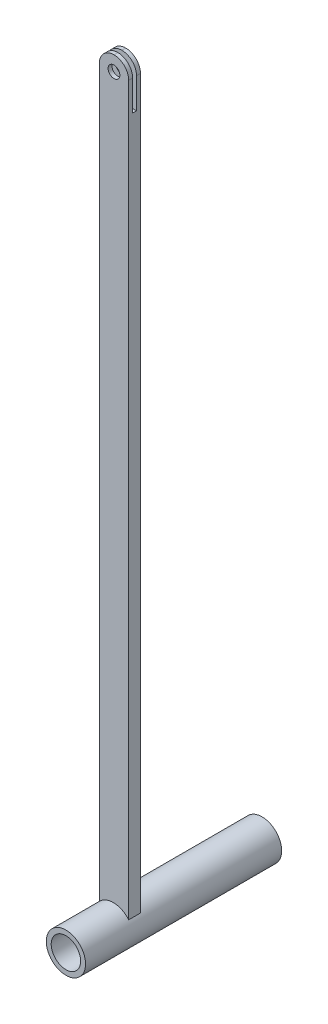
ISO-10303-21;
HEADER;
FILE_DESCRIPTION(('STEP AP214'),'2;1');
FILE_NAME('part.step','',(''),(''),'','','');
FILE_SCHEMA(('AUTOMOTIVE_DESIGN { 1 0 10303 214 1 1 1 1 }'));
ENDSEC;
DATA;
#1=APPLICATION_CONTEXT('core data for automotive mechanical design processes');
#2=APPLICATION_PROTOCOL_DEFINITION('international standard','automotive_design',2000,#1);
#3=PRODUCT_CONTEXT('',#1,'mechanical');
#4=PRODUCT('Part','Part','',(#3));
#5=PRODUCT_RELATED_PRODUCT_CATEGORY('part','',(#4));
#6=PRODUCT_DEFINITION_FORMATION('','',#4);
#7=PRODUCT_DEFINITION_CONTEXT('part definition',#1,'design');
#8=PRODUCT_DEFINITION('design','',#6,#7);
#9=PRODUCT_DEFINITION_SHAPE('','',#8);
#10=(LENGTH_UNIT() NAMED_UNIT(*) SI_UNIT(.MILLI.,.METRE.));
#11=(NAMED_UNIT(*) PLANE_ANGLE_UNIT() SI_UNIT($,.RADIAN.));
#12=(NAMED_UNIT(*) SI_UNIT($,.STERADIAN.) SOLID_ANGLE_UNIT());
#13=UNCERTAINTY_MEASURE_WITH_UNIT(LENGTH_MEASURE(1.E-05),#10,'distance_accuracy_value','');
#14=(GEOMETRIC_REPRESENTATION_CONTEXT(3) GLOBAL_UNCERTAINTY_ASSIGNED_CONTEXT((#13)) GLOBAL_UNIT_ASSIGNED_CONTEXT((#10,
#11,#12)) REPRESENTATION_CONTEXT('',''));
#15=CARTESIAN_POINT('',(0.,0.,0.));
#16=DIRECTION('',(0.,0.,1.));
#17=DIRECTION('',(1.,0.,0.));
#18=AXIS2_PLACEMENT_3D('',#15,#16,#17);
#19=CARTESIAN_POINT('',(0.280971345176614,377.01,0.));
#20=DIRECTION('',(0.,0.,1.));
#21=DIRECTION('',(1.,0.,0.));
#22=AXIS2_PLACEMENT_3D('',#19,#20,#21);
#23=CYLINDRICAL_SURFACE('',#22,7.5);
#24=CARTESIAN_POINT('',(0.280971345176614,377.01,23.7797928905931));
#25=DIRECTION('',(0.,0.,1.));
#26=DIRECTION('',(1.,0.,0.));
#27=AXIS2_PLACEMENT_3D('',#24,#25,#26);
#28=CIRCLE('',#27,7.5);
#29=CARTESIAN_POINT('',(-7.21902865482339,377.01,23.7797928905931));
#30=VERTEX_POINT('',#29);
#31=CARTESIAN_POINT('',(0.280971345176614,384.51,23.7797928905931));
#32=VERTEX_POINT('',#31);
#33=EDGE_CURVE('E148',#30,#32,#28,.F.);
#34=ORIENTED_EDGE('',*,*,#33,.F.);
#35=DIRECTION('',(0.,0.,1.));
#36=VECTOR('',#35,1.);
#37=CARTESIAN_POINT('',(-7.21902865482339,377.01,19.7797928905931));
#38=LINE('',#37,#36);
#39=CARTESIAN_POINT('',(-7.21902865482339,377.01,25.7797928905931));
#40=VERTEX_POINT('',#39);
#41=EDGE_CURVE('E44',#40,#30,#38,.F.);
#42=ORIENTED_EDGE('',*,*,#41,.F.);
#43=CARTESIAN_POINT('',(0.280971345176614,377.01,25.7797928905931));
#44=DIRECTION('',(0.,0.,1.));
#45=DIRECTION('',(1.,0.,0.));
#46=AXIS2_PLACEMENT_3D('',#43,#44,#45);
#47=CIRCLE('',#46,7.5);
#48=CARTESIAN_POINT('',(0.280971345176614,384.51,25.7797928905931));
#49=VERTEX_POINT('',#48);
#50=EDGE_CURVE('E199',#49,#40,#47,.T.);
#51=ORIENTED_EDGE('',*,*,#50,.F.);
#52=DIRECTION('',(0.,0.,1.));
#53=VECTOR('',#52,1.);
#54=CARTESIAN_POINT('',(0.280971345176614,384.51,0.));
#55=LINE('',#54,#53);
#56=EDGE_CURVE('E59',#32,#49,#55,.T.);
#57=ORIENTED_EDGE('',*,*,#56,.F.);
#58=EDGE_LOOP('',(#34,#42,#51,#57));
#59=FACE_BOUND('',#58,.T.);
#60=ADVANCED_FACE('F36',(#59),#23,.T.);
#61=CARTESIAN_POINT('',(0.280971345176615,377.01,0.));
#62=DIRECTION('',(0.,0.,-1.));
#63=DIRECTION('',(-1.,0.,0.));
#64=AXIS2_PLACEMENT_3D('',#61,#62,#63);
#65=CYLINDRICAL_SURFACE('',#64,7.5);
#66=CARTESIAN_POINT('',(0.280971345176615,377.01,23.7797928905931));
#67=DIRECTION('',(0.,0.,1.));
#68=DIRECTION('',(1.,0.,0.));
#69=AXIS2_PLACEMENT_3D('',#66,#67,#68);
#70=CIRCLE('',#69,7.5);
#71=CARTESIAN_POINT('',(7.78097134517662,377.01,23.7797928905931));
#72=VERTEX_POINT('',#71);
#73=EDGE_CURVE('E146',#32,#72,#70,.F.);
#74=ORIENTED_EDGE('',*,*,#73,.F.);
#75=ORIENTED_EDGE('',*,*,#56,.T.);
#76=CARTESIAN_POINT('',(0.280971345176615,377.01,25.7797928905931));
#77=DIRECTION('',(0.,0.,1.));
#78=DIRECTION('',(1.,0.,0.));
#79=AXIS2_PLACEMENT_3D('',#76,#77,#78);
#80=CIRCLE('',#79,7.5);
#81=CARTESIAN_POINT('',(7.78097134517662,377.01,25.7797928905931));
#82=VERTEX_POINT('',#81);
#83=EDGE_CURVE('E201',#82,#49,#80,.T.);
#84=ORIENTED_EDGE('',*,*,#83,.F.);
#85=DIRECTION('',(0.,0.,-1.));
#86=VECTOR('',#85,1.);
#87=CARTESIAN_POINT('',(7.78097134517662,377.01,19.7797928905931));
#88=LINE('',#87,#86);
#89=EDGE_CURVE('E195',#72,#82,#88,.F.);
#90=ORIENTED_EDGE('',*,*,#89,.F.);
#91=EDGE_LOOP('',(#74,#75,#84,#90));
#92=FACE_BOUND('',#91,.T.);
#93=ADVANCED_FACE('F230',(#92),#65,.T.);
#94=CARTESIAN_POINT('',(0.280971345176615,377.01,29.7797928905931));
#95=DIRECTION('',(0.,0.,-1.));
#96=DIRECTION('',(-1.,0.,0.));
#97=AXIS2_PLACEMENT_3D('',#94,#95,#96);
#98=CYLINDRICAL_SURFACE('',#97,3.);
#99=CARTESIAN_POINT('',(0.280971345176614,377.01,23.7797928905931));
#100=DIRECTION('',(0.,0.,1.));
#101=DIRECTION('',(1.,0.,0.));
#102=AXIS2_PLACEMENT_3D('',#99,#100,#101);
#103=CIRCLE('',#102,3.);
#104=CARTESIAN_POINT('',(3.28097134517662,377.01,23.7797928905931));
#105=VERTEX_POINT('',#104);
#106=EDGE_CURVE('E145',#105,#105,#103,.F.);
#107=ORIENTED_EDGE('',*,*,#106,.T.);
#108=EDGE_LOOP('',(#107));
#109=FACE_BOUND('',#108,.T.);
#110=CARTESIAN_POINT('',(0.280971345176615,377.01,25.7797928905931));
#111=DIRECTION('',(0.,0.,1.));
#112=DIRECTION('',(1.,0.,0.));
#113=AXIS2_PLACEMENT_3D('',#110,#111,#112);
#114=CIRCLE('',#113,3.);
#115=CARTESIAN_POINT('',(3.28097134517662,377.01,25.7797928905931));
#116=VERTEX_POINT('',#115);
#117=EDGE_CURVE('E155',#116,#116,#114,.T.);
#118=ORIENTED_EDGE('',*,*,#117,.T.);
#119=EDGE_LOOP('',(#118));
#120=FACE_BOUND('',#119,.T.);
#121=ADVANCED_FACE('F213',(#109,#120),#98,.F.);
#122=CARTESIAN_POINT('',(0.,0.,50.));
#123=DIRECTION('',(0.,0.,1.));
#124=DIRECTION('',(1.,0.,0.));
#125=AXIS2_PLACEMENT_3D('',#122,#123,#124);
#126=PLANE('',#125);
#127=CARTESIAN_POINT('',(0.,0.,50.));
#128=DIRECTION('',(0.,0.,1.));
#129=DIRECTION('',(1.,0.,0.));
#130=AXIS2_PLACEMENT_3D('',#127,#128,#129);
#131=CIRCLE('',#130,10.);
#132=CARTESIAN_POINT('',(10.,0.,50.));
#133=VERTEX_POINT('',#132);
#134=EDGE_CURVE('E186',#133,#133,#131,.T.);
#135=ORIENTED_EDGE('',*,*,#134,.T.);
#136=EDGE_LOOP('',(#135));
#137=FACE_BOUND('',#136,.T.);
#138=CARTESIAN_POINT('',(0.,0.,50.));
#139=DIRECTION('',(0.,0.,1.));
#140=DIRECTION('',(1.,0.,0.));
#141=AXIS2_PLACEMENT_3D('',#138,#139,#140);
#142=CIRCLE('',#141,7.5);
#143=CARTESIAN_POINT('',(7.5,0.,50.));
#144=VERTEX_POINT('',#143);
#145=EDGE_CURVE('E180',#144,#144,#142,.T.);
#146=ORIENTED_EDGE('',*,*,#145,.F.);
#147=EDGE_LOOP('',(#146));
#148=FACE_BOUND('',#147,.T.);
#149=ADVANCED_FACE('F283',(#137,#148),#126,.T.);
#150=CARTESIAN_POINT('',(0.,0.,-50.));
#151=DIRECTION('',(0.,0.,1.));
#152=DIRECTION('',(1.,0.,0.));
#153=AXIS2_PLACEMENT_3D('',#150,#151,#152);
#154=PLANE('',#153);
#155=CARTESIAN_POINT('',(0.,0.,-50.));
#156=DIRECTION('',(0.,0.,1.));
#157=DIRECTION('',(1.,0.,0.));
#158=AXIS2_PLACEMENT_3D('',#155,#156,#157);
#159=CIRCLE('',#158,10.);
#160=CARTESIAN_POINT('',(10.,0.,-50.));
#161=VERTEX_POINT('',#160);
#162=EDGE_CURVE('E183',#161,#161,#159,.T.);
#163=ORIENTED_EDGE('',*,*,#162,.F.);
#164=EDGE_LOOP('',(#163));
#165=FACE_BOUND('',#164,.T.);
#166=CARTESIAN_POINT('',(0.,0.,-50.));
#167=DIRECTION('',(0.,0.,1.));
#168=DIRECTION('',(1.,0.,0.));
#169=AXIS2_PLACEMENT_3D('',#166,#167,#168);
#170=CIRCLE('',#169,7.5);
#171=CARTESIAN_POINT('',(7.5,0.,-50.));
#172=VERTEX_POINT('',#171);
#173=EDGE_CURVE('E164',#172,#172,#170,.T.);
#174=ORIENTED_EDGE('',*,*,#173,.T.);
#175=EDGE_LOOP('',(#174));
#176=FACE_BOUND('',#175,.T.);
#177=ADVANCED_FACE('F286',(#165,#176),#154,.F.);
#178=CARTESIAN_POINT('',(0.,0.,50.));
#179=DIRECTION('',(0.,0.,-1.));
#180=DIRECTION('',(-1.,0.,0.));
#181=AXIS2_PLACEMENT_3D('',#178,#179,#180);
#182=CYLINDRICAL_SURFACE('',#181,10.);
#183=DIRECTION('',(0.,0.,-1.));
#184=VECTOR('',#183,1.);
#185=CARTESIAN_POINT('',(-7.21902865482339,6.91994402295559,50.));
#186=LINE('',#185,#184);
#187=CARTESIAN_POINT('',(-7.21902865482339,6.91994402295559,19.7797928905931));
#188=VERTEX_POINT('',#187);
#189=CARTESIAN_POINT('',(-7.21902865482339,6.91994402295559,25.7797928905931));
#190=VERTEX_POINT('',#189);
#191=EDGE_CURVE('E156',#188,#190,#186,.F.);
#192=ORIENTED_EDGE('',*,*,#191,.F.);
#193=CARTESIAN_POINT('',(0.,0.,19.7797928905931));
#194=DIRECTION('',(0.,0.,-1.));
#195=DIRECTION('',(-1.,0.,0.));
#196=AXIS2_PLACEMENT_3D('',#193,#194,#195);
#197=CIRCLE('',#196,10.);
#198=CARTESIAN_POINT('',(7.78097134517662,6.28143971757593,19.7797928905931));
#199=VERTEX_POINT('',#198);
#200=EDGE_CURVE('E160',#199,#188,#197,.F.);
#201=ORIENTED_EDGE('',*,*,#200,.F.);
#202=DIRECTION('',(0.,0.,-1.));
#203=VECTOR('',#202,1.);
#204=CARTESIAN_POINT('',(7.78097134517662,6.28143971757593,50.));
#205=LINE('',#204,#203);
#206=CARTESIAN_POINT('',(7.78097134517662,6.28143971757593,25.7797928905931));
#207=VERTEX_POINT('',#206);
#208=EDGE_CURVE('E162',#207,#199,#205,.T.);
#209=ORIENTED_EDGE('',*,*,#208,.F.);
#210=CARTESIAN_POINT('',(0.,0.,25.7797928905931));
#211=DIRECTION('',(0.,0.,1.));
#212=DIRECTION('',(1.,0.,0.));
#213=AXIS2_PLACEMENT_3D('',#210,#211,#212);
#214=CIRCLE('',#213,10.);
#215=EDGE_CURVE('E159',#190,#207,#214,.F.);
#216=ORIENTED_EDGE('',*,*,#215,.F.);
#217=EDGE_LOOP('',(#192,#201,#209,#216));
#218=FACE_BOUND('',#217,.T.);
#219=ORIENTED_EDGE('',*,*,#134,.F.);
#220=EDGE_LOOP('',(#219));
#221=FACE_BOUND('',#220,.T.);
#222=ORIENTED_EDGE('',*,*,#162,.T.);
#223=EDGE_LOOP('',(#222));
#224=FACE_BOUND('',#223,.T.);
#225=ADVANCED_FACE('F261',(#218,#221,#224),#182,.T.);
#226=CARTESIAN_POINT('',(0.,0.,50.));
#227=DIRECTION('',(0.,0.,-1.));
#228=DIRECTION('',(-1.,0.,0.));
#229=AXIS2_PLACEMENT_3D('',#226,#227,#228);
#230=CYLINDRICAL_SURFACE('',#229,7.5);
#231=ORIENTED_EDGE('',*,*,#145,.T.);
#232=EDGE_LOOP('',(#231));
#233=FACE_BOUND('',#232,.T.);
#234=ORIENTED_EDGE('',*,*,#173,.F.);
#235=EDGE_LOOP('',(#234));
#236=FACE_BOUND('',#235,.T.);
#237=ADVANCED_FACE('F277',(#233,#236),#230,.F.);
#238=CARTESIAN_POINT('',(-7.21902865482339,-10.001,19.7797928905931));
#239=DIRECTION('',(0.,0.,-1.));
#240=DIRECTION('',(-1.,0.,0.));
#241=AXIS2_PLACEMENT_3D('',#238,#239,#240);
#242=PLANE('',#241);
#243=CARTESIAN_POINT('',(0.280971345176614,377.01,19.7797928905931));
#244=DIRECTION('',(0.,0.,-1.));
#245=DIRECTION('',(-1.,0.,0.));
#246=AXIS2_PLACEMENT_3D('',#243,#244,#245);
#247=CIRCLE('',#246,3.);
#248=CARTESIAN_POINT('',(-2.71902865482339,377.01,19.7797928905931));
#249=VERTEX_POINT('',#248);
#250=EDGE_CURVE('E152',#249,#249,#247,.T.);
#251=ORIENTED_EDGE('',*,*,#250,.F.);
#252=EDGE_LOOP('',(#251));
#253=FACE_BOUND('',#252,.T.);
#254=CARTESIAN_POINT('',(0.280971345176614,377.01,19.7797928905931));
#255=DIRECTION('',(0.,0.,-1.));
#256=DIRECTION('',(-1.,0.,0.));
#257=AXIS2_PLACEMENT_3D('',#254,#255,#256);
#258=CIRCLE('',#257,7.5);
#259=CARTESIAN_POINT('',(-7.21902865482339,377.01,19.7797928905931));
#260=VERTEX_POINT('',#259);
#261=CARTESIAN_POINT('',(0.280971345176614,384.51,19.7797928905931));
#262=VERTEX_POINT('',#261);
#263=EDGE_CURVE('E189',#260,#262,#258,.T.);
#264=ORIENTED_EDGE('',*,*,#263,.T.);
#265=CARTESIAN_POINT('',(0.280971345176615,377.01,19.7797928905931));
#266=DIRECTION('',(0.,0.,-1.));
#267=DIRECTION('',(-1.,0.,0.));
#268=AXIS2_PLACEMENT_3D('',#265,#266,#267);
#269=CIRCLE('',#268,7.5);
#270=CARTESIAN_POINT('',(7.78097134517662,377.01,19.7797928905931));
#271=VERTEX_POINT('',#270);
#272=EDGE_CURVE('E193',#262,#271,#269,.T.);
#273=ORIENTED_EDGE('',*,*,#272,.T.);
#274=DIRECTION('',(0.,1.,0.));
#275=VECTOR('',#274,1.);
#276=CARTESIAN_POINT('',(7.78097134517662,-10.001,19.7797928905931));
#277=LINE('',#276,#275);
#278=EDGE_CURVE('E174',#199,#271,#277,.T.);
#279=ORIENTED_EDGE('',*,*,#278,.F.);
#280=ORIENTED_EDGE('',*,*,#200,.T.);
#281=DIRECTION('',(0.,1.,0.));
#282=VECTOR('',#281,1.);
#283=CARTESIAN_POINT('',(-7.21902865482339,-10.001,19.7797928905931));
#284=LINE('',#283,#282);
#285=EDGE_CURVE('E171',#188,#260,#284,.T.);
#286=ORIENTED_EDGE('',*,*,#285,.T.);
#287=EDGE_LOOP('',(#264,#273,#279,#280,#286));
#288=FACE_BOUND('',#287,.T.);
#289=ADVANCED_FACE('F253',(#253,#288),#242,.T.);
#290=CARTESIAN_POINT('',(-7.21902865482339,-10.001,19.7797928905931));
#291=DIRECTION('',(-1.,0.,0.));
#292=DIRECTION('',(0.,0.,1.));
#293=AXIS2_PLACEMENT_3D('',#290,#291,#292);
#294=PLANE('',#293);
#295=DIRECTION('',(0.,1.,0.));
#296=VECTOR('',#295,1.);
#297=CARTESIAN_POINT('',(-7.21902865482339,384.51,23.7797928905931));
#298=LINE('',#297,#296);
#299=CARTESIAN_POINT('',(-7.21902865482339,361.51,23.7797928905931));
#300=VERTEX_POINT('',#299);
#301=EDGE_CURVE('E132',#300,#30,#298,.T.);
#302=ORIENTED_EDGE('',*,*,#301,.F.);
#303=DIRECTION('',(0.,0.,1.));
#304=VECTOR('',#303,1.);
#305=CARTESIAN_POINT('',(-7.21902865482339,361.51,21.7797928905931));
#306=LINE('',#305,#304);
#307=CARTESIAN_POINT('',(-7.21902865482339,361.51,21.7797928905931));
#308=VERTEX_POINT('',#307);
#309=EDGE_CURVE('E119',#308,#300,#306,.T.);
#310=ORIENTED_EDGE('',*,*,#309,.F.);
#311=DIRECTION('',(0.,-1.,0.));
#312=VECTOR('',#311,1.);
#313=CARTESIAN_POINT('',(-7.21902865482339,384.51,21.7797928905931));
#314=LINE('',#313,#312);
#315=CARTESIAN_POINT('',(-7.21902865482339,377.01,21.7797928905931));
#316=VERTEX_POINT('',#315);
#317=EDGE_CURVE('E125',#316,#308,#314,.T.);
#318=ORIENTED_EDGE('',*,*,#317,.F.);
#319=EDGE_CURVE('E203',#316,#260,#38,.F.);
#320=ORIENTED_EDGE('',*,*,#319,.T.);
#321=ORIENTED_EDGE('',*,*,#285,.F.);
#322=ORIENTED_EDGE('',*,*,#191,.T.);
#323=DIRECTION('',(0.,1.,0.));
#324=VECTOR('',#323,1.);
#325=CARTESIAN_POINT('',(-7.21902865482339,-10.001,25.7797928905931));
#326=LINE('',#325,#324);
#327=EDGE_CURVE('E168',#190,#40,#326,.T.);
#328=ORIENTED_EDGE('',*,*,#327,.T.);
#329=ORIENTED_EDGE('',*,*,#41,.T.);
#330=EDGE_LOOP('',(#302,#310,#318,#320,#321,#322,#328,#329));
#331=FACE_BOUND('',#330,.T.);
#332=ADVANCED_FACE('F134',(#331),#294,.T.);
#333=CARTESIAN_POINT('',(-7.21902865482339,-10.001,25.7797928905931));
#334=DIRECTION('',(0.,0.,1.));
#335=DIRECTION('',(1.,0.,0.));
#336=AXIS2_PLACEMENT_3D('',#333,#334,#335);
#337=PLANE('',#336);
#338=ORIENTED_EDGE('',*,*,#117,.F.);
#339=EDGE_LOOP('',(#338));
#340=FACE_BOUND('',#339,.T.);
#341=DIRECTION('',(0.,1.,0.));
#342=VECTOR('',#341,1.);
#343=CARTESIAN_POINT('',(7.78097134517662,-10.001,25.7797928905931));
#344=LINE('',#343,#342);
#345=EDGE_CURVE('E165',#207,#82,#344,.T.);
#346=ORIENTED_EDGE('',*,*,#345,.T.);
#347=ORIENTED_EDGE('',*,*,#83,.T.);
#348=ORIENTED_EDGE('',*,*,#50,.T.);
#349=ORIENTED_EDGE('',*,*,#327,.F.);
#350=ORIENTED_EDGE('',*,*,#215,.T.);
#351=EDGE_LOOP('',(#346,#347,#348,#349,#350));
#352=FACE_BOUND('',#351,.T.);
#353=ADVANCED_FACE('F244',(#340,#352),#337,.T.);
#354=CARTESIAN_POINT('',(7.78097134517662,-10.001,19.7797928905931));
#355=DIRECTION('',(1.,0.,0.));
#356=DIRECTION('',(0.,0.,-1.));
#357=AXIS2_PLACEMENT_3D('',#354,#355,#356);
#358=PLANE('',#357);
#359=DIRECTION('',(0.,-1.,0.));
#360=VECTOR('',#359,1.);
#361=CARTESIAN_POINT('',(7.78097134517662,-10.001,23.7797928905931));
#362=LINE('',#361,#360);
#363=CARTESIAN_POINT('',(7.78097134517662,361.51,23.7797928905931));
#364=VERTEX_POINT('',#363);
#365=EDGE_CURVE('E150',#72,#364,#362,.T.);
#366=ORIENTED_EDGE('',*,*,#365,.F.);
#367=ORIENTED_EDGE('',*,*,#89,.T.);
#368=ORIENTED_EDGE('',*,*,#345,.F.);
#369=ORIENTED_EDGE('',*,*,#208,.T.);
#370=ORIENTED_EDGE('',*,*,#278,.T.);
#371=CARTESIAN_POINT('',(7.78097134517662,377.01,21.7797928905931));
#372=VERTEX_POINT('',#371);
#373=EDGE_CURVE('E196',#271,#372,#88,.F.);
#374=ORIENTED_EDGE('',*,*,#373,.T.);
#375=DIRECTION('',(0.,1.,0.));
#376=VECTOR('',#375,1.);
#377=CARTESIAN_POINT('',(7.78097134517662,-10.001,21.7797928905931));
#378=LINE('',#377,#376);
#379=CARTESIAN_POINT('',(7.78097134517662,361.51,21.7797928905931));
#380=VERTEX_POINT('',#379);
#381=EDGE_CURVE('E51',#380,#372,#378,.T.);
#382=ORIENTED_EDGE('',*,*,#381,.F.);
#383=DIRECTION('',(0.,0.,-1.));
#384=VECTOR('',#383,1.);
#385=CARTESIAN_POINT('',(7.78097134517662,361.51,19.7797928905931));
#386=LINE('',#385,#384);
#387=EDGE_CURVE('E11',#364,#380,#386,.T.);
#388=ORIENTED_EDGE('',*,*,#387,.F.);
#389=EDGE_LOOP('',(#366,#367,#368,#369,#370,#374,#382,#388));
#390=FACE_BOUND('',#389,.T.);
#391=ADVANCED_FACE('F237',(#390),#358,.T.);
#392=CARTESIAN_POINT('',(0.280971345176614,377.01,21.7797928905931));
#393=DIRECTION('',(0.,0.,-1.));
#394=DIRECTION('',(-1.,0.,0.));
#395=AXIS2_PLACEMENT_3D('',#392,#393,#394);
#396=CIRCLE('',#395,7.5);
#397=CARTESIAN_POINT('',(0.280971345176614,384.51,21.7797928905931));
#398=VERTEX_POINT('',#397);
#399=EDGE_CURVE('E129',#398,#316,#396,.F.);
#400=ORIENTED_EDGE('',*,*,#399,.F.);
#401=EDGE_CURVE('E177',#262,#398,#55,.T.);
#402=ORIENTED_EDGE('',*,*,#401,.F.);
#403=ORIENTED_EDGE('',*,*,#263,.F.);
#404=ORIENTED_EDGE('',*,*,#319,.F.);
#405=EDGE_LOOP('',(#400,#402,#403,#404));
#406=FACE_BOUND('',#405,.T.);
#407=ADVANCED_FACE('F38',(#406),#23,.T.);
#408=CARTESIAN_POINT('',(0.280971345176615,377.01,21.7797928905931));
#409=DIRECTION('',(0.,0.,-1.));
#410=DIRECTION('',(-1.,0.,0.));
#411=AXIS2_PLACEMENT_3D('',#408,#409,#410);
#412=CIRCLE('',#411,7.5);
#413=EDGE_CURVE('E141',#372,#398,#412,.F.);
#414=ORIENTED_EDGE('',*,*,#413,.F.);
#415=ORIENTED_EDGE('',*,*,#373,.F.);
#416=ORIENTED_EDGE('',*,*,#272,.F.);
#417=ORIENTED_EDGE('',*,*,#401,.T.);
#418=EDGE_LOOP('',(#414,#415,#416,#417));
#419=FACE_BOUND('',#418,.T.);
#420=ADVANCED_FACE('F226',(#419),#65,.T.);
#421=CARTESIAN_POINT('',(0.280971345176614,377.01,21.7797928905931));
#422=DIRECTION('',(0.,0.,-1.));
#423=DIRECTION('',(-1.,0.,0.));
#424=AXIS2_PLACEMENT_3D('',#421,#422,#423);
#425=CIRCLE('',#424,3.);
#426=CARTESIAN_POINT('',(-2.71902865482339,377.01,21.7797928905931));
#427=VERTEX_POINT('',#426);
#428=EDGE_CURVE('E139',#427,#427,#425,.F.);
#429=ORIENTED_EDGE('',*,*,#428,.T.);
#430=EDGE_LOOP('',(#429));
#431=FACE_BOUND('',#430,.T.);
#432=ORIENTED_EDGE('',*,*,#250,.T.);
#433=EDGE_LOOP('',(#432));
#434=FACE_BOUND('',#433,.T.);
#435=ADVANCED_FACE('F218',(#431,#434),#98,.F.);
#436=CARTESIAN_POINT('',(12.7809713451766,384.51,23.7797928905931));
#437=DIRECTION('',(0.,0.,1.));
#438=DIRECTION('',(1.,0.,0.));
#439=AXIS2_PLACEMENT_3D('',#436,#437,#438);
#440=PLANE('',#439);
#441=ORIENTED_EDGE('',*,*,#365,.T.);
#442=DIRECTION('',(-1.,0.,0.));
#443=VECTOR('',#442,1.);
#444=CARTESIAN_POINT('',(12.7809713451766,361.51,23.7797928905931));
#445=LINE('',#444,#443);
#446=EDGE_CURVE('E122',#364,#300,#445,.T.);
#447=ORIENTED_EDGE('',*,*,#446,.T.);
#448=ORIENTED_EDGE('',*,*,#301,.T.);
#449=ORIENTED_EDGE('',*,*,#33,.T.);
#450=ORIENTED_EDGE('',*,*,#73,.T.);
#451=EDGE_LOOP('',(#441,#447,#448,#449,#450));
#452=FACE_BOUND('',#451,.T.);
#453=ORIENTED_EDGE('',*,*,#106,.F.);
#454=EDGE_LOOP('',(#453));
#455=FACE_BOUND('',#454,.T.);
#456=ADVANCED_FACE('F216',(#452,#455),#440,.F.);
#457=CARTESIAN_POINT('',(12.7809713451766,384.51,21.7797928905931));
#458=DIRECTION('',(0.,0.,-1.));
#459=DIRECTION('',(-1.,0.,0.));
#460=AXIS2_PLACEMENT_3D('',#457,#458,#459);
#461=PLANE('',#460);
#462=ORIENTED_EDGE('',*,*,#381,.T.);
#463=ORIENTED_EDGE('',*,*,#413,.T.);
#464=ORIENTED_EDGE('',*,*,#399,.T.);
#465=ORIENTED_EDGE('',*,*,#317,.T.);
#466=DIRECTION('',(-1.,0.,0.));
#467=VECTOR('',#466,1.);
#468=CARTESIAN_POINT('',(12.7809713451766,361.51,21.7797928905931));
#469=LINE('',#468,#467);
#470=EDGE_CURVE('E114',#380,#308,#469,.T.);
#471=ORIENTED_EDGE('',*,*,#470,.F.);
#472=EDGE_LOOP('',(#462,#463,#464,#465,#471));
#473=FACE_BOUND('',#472,.T.);
#474=ORIENTED_EDGE('',*,*,#428,.F.);
#475=EDGE_LOOP('',(#474));
#476=FACE_BOUND('',#475,.T.);
#477=ADVANCED_FACE('F126',(#473,#476),#461,.F.);
#478=CARTESIAN_POINT('',(12.7809713451766,361.51,21.7797928905931));
#479=DIRECTION('',(0.,-1.,0.));
#480=DIRECTION('',(0.,0.,-1.));
#481=AXIS2_PLACEMENT_3D('',#478,#479,#480);
#482=PLANE('',#481);
#483=ORIENTED_EDGE('',*,*,#387,.T.);
#484=ORIENTED_EDGE('',*,*,#470,.T.);
#485=ORIENTED_EDGE('',*,*,#309,.T.);
#486=ORIENTED_EDGE('',*,*,#446,.F.);
#487=EDGE_LOOP('',(#483,#484,#485,#486));
#488=FACE_BOUND('',#487,.T.);
#489=ADVANCED_FACE('F116',(#488),#482,.F.);
#490=CLOSED_SHELL('',(#60,#93,#121,#149,#177,#225,#237,#289,#332,#353,#391,#407,#420,#435,#456,
#477,#489));
#491=MANIFOLD_SOLID_BREP('B2',#490);
#492=ADVANCED_BREP_SHAPE_REPRESENTATION('',(#18,#491),#14);
#493=SHAPE_DEFINITION_REPRESENTATION(#9,#492);
ENDSEC;
END-ISO-10303-21;
